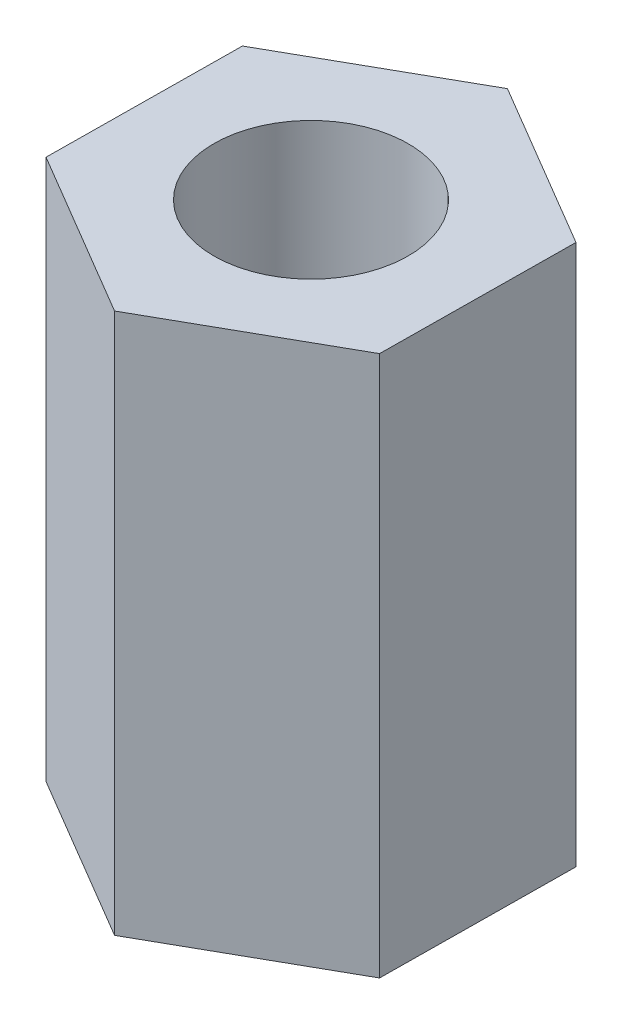
ISO-10303-21;
HEADER;
FILE_DESCRIPTION(('STEP AP214'),'2;1');
FILE_NAME('part.step','',(''),(''),'','','');
FILE_SCHEMA(('AUTOMOTIVE_DESIGN { 1 0 10303 214 1 1 1 1 }'));
ENDSEC;
DATA;
#1=APPLICATION_CONTEXT('core data for automotive mechanical design processes');
#2=APPLICATION_PROTOCOL_DEFINITION('international standard','automotive_design',2000,#1);
#3=PRODUCT_CONTEXT('',#1,'mechanical');
#4=PRODUCT('Part','Part','',(#3));
#5=PRODUCT_RELATED_PRODUCT_CATEGORY('part','',(#4));
#6=PRODUCT_DEFINITION_FORMATION('','',#4);
#7=PRODUCT_DEFINITION_CONTEXT('part definition',#1,'design');
#8=PRODUCT_DEFINITION('design','',#6,#7);
#9=PRODUCT_DEFINITION_SHAPE('','',#8);
#10=(LENGTH_UNIT() NAMED_UNIT(*) SI_UNIT(.MILLI.,.METRE.));
#11=(NAMED_UNIT(*) PLANE_ANGLE_UNIT() SI_UNIT($,.RADIAN.));
#12=(NAMED_UNIT(*) SI_UNIT($,.STERADIAN.) SOLID_ANGLE_UNIT());
#13=UNCERTAINTY_MEASURE_WITH_UNIT(LENGTH_MEASURE(1.E-05),#10,'distance_accuracy_value','');
#14=(GEOMETRIC_REPRESENTATION_CONTEXT(3) GLOBAL_UNCERTAINTY_ASSIGNED_CONTEXT((#13)) GLOBAL_UNIT_ASSIGNED_CONTEXT((#10,
#11,#12)) REPRESENTATION_CONTEXT('',''));
#15=CARTESIAN_POINT('',(0.,0.,0.));
#16=DIRECTION('',(0.,0.,1.));
#17=DIRECTION('',(1.,0.,0.));
#18=AXIS2_PLACEMENT_3D('',#15,#16,#17);
#19=CARTESIAN_POINT('',(0.,8.34,0.));
#20=DIRECTION('',(0.,1.,0.));
#21=DIRECTION('',(0.,0.,1.));
#22=AXIS2_PLACEMENT_3D('',#19,#20,#21);
#23=PLANE('',#22);
#24=DIRECTION('',(-0.870950486189625,0.,0.491370787294132));
#25=VECTOR('',#24,1.);
#26=CARTESIAN_POINT('',(0.0298069758616038,8.34,-2.99985192037707));
#27=LINE('',#26,#25);
#28=CARTESIAN_POINT('',(0.0298069758616038,8.34,-2.99985192037707));
#29=VERTEX_POINT('',#28);
#30=CARTESIAN_POINT('',(-2.58304448270727,8.34,-1.52573955849467));
#31=VERTEX_POINT('',#30);
#32=EDGE_CURVE('E132',#29,#31,#27,.T.);
#33=ORIENTED_EDGE('',*,*,#32,.T.);
#34=DIRECTION('',(-0.00993565862053424,0.,0.99995064012569));
#35=VECTOR('',#34,1.);
#36=CARTESIAN_POINT('',(-2.58304448270727,8.34,-1.52573955849467));
#37=LINE('',#36,#35);
#38=CARTESIAN_POINT('',(-2.61285145856888,8.34,1.4741123618824));
#39=VERTEX_POINT('',#38);
#40=EDGE_CURVE('E90',#31,#39,#37,.T.);
#41=ORIENTED_EDGE('',*,*,#40,.T.);
#42=DIRECTION('',(0.861014827569091,0.,0.508579852831557));
#43=VECTOR('',#42,1.);
#44=CARTESIAN_POINT('',(-2.61285145856888,8.34,1.4741123618824));
#45=LINE('',#44,#43);
#46=CARTESIAN_POINT('',(-0.0298069758616014,8.34,2.99985192037707));
#47=VERTEX_POINT('',#46);
#48=EDGE_CURVE('E103',#39,#47,#45,.T.);
#49=ORIENTED_EDGE('',*,*,#48,.T.);
#50=DIRECTION('',(0.870950486189626,0.,-0.491370787294132));
#51=VECTOR('',#50,1.);
#52=CARTESIAN_POINT('',(-0.0298069758616014,8.34,2.99985192037707));
#53=LINE('',#52,#51);
#54=CARTESIAN_POINT('',(2.58304448270727,8.34,1.52573955849467));
#55=VERTEX_POINT('',#54);
#56=EDGE_CURVE('E97',#47,#55,#53,.T.);
#57=ORIENTED_EDGE('',*,*,#56,.T.);
#58=DIRECTION('',(0.00993565862053424,0.,-0.99995064012569));
#59=VECTOR('',#58,1.);
#60=CARTESIAN_POINT('',(2.58304448270727,8.34,1.52573955849467));
#61=LINE('',#60,#59);
#62=CARTESIAN_POINT('',(2.61285145856888,8.34,-1.4741123618824));
#63=VERTEX_POINT('',#62);
#64=EDGE_CURVE('E101',#55,#63,#61,.T.);
#65=ORIENTED_EDGE('',*,*,#64,.T.);
#66=DIRECTION('',(-0.861014827569091,0.,-0.508579852831558));
#67=VECTOR('',#66,1.);
#68=CARTESIAN_POINT('',(2.61285145856888,8.34,-1.4741123618824));
#69=LINE('',#68,#67);
#70=EDGE_CURVE('E53',#63,#29,#69,.T.);
#71=ORIENTED_EDGE('',*,*,#70,.T.);
#72=EDGE_LOOP('',(#33,#41,#49,#57,#65,#71));
#73=FACE_BOUND('',#72,.T.);
#74=CARTESIAN_POINT('',(0.,8.34,0.));
#75=DIRECTION('',(0.,1.,0.));
#76=DIRECTION('',(0.,0.,1.));
#77=AXIS2_PLACEMENT_3D('',#74,#75,#76);
#78=CIRCLE('',#77,1.5);
#79=CARTESIAN_POINT('',(0.,8.34,1.5));
#80=VERTEX_POINT('',#79);
#81=EDGE_CURVE('E125',#80,#80,#78,.T.);
#82=ORIENTED_EDGE('',*,*,#81,.F.);
#83=EDGE_LOOP('',(#82));
#84=FACE_BOUND('',#83,.T.);
#85=ADVANCED_FACE('F36',(#73,#84),#23,.T.);
#86=CARTESIAN_POINT('',(0.,0.,0.));
#87=DIRECTION('',(0.,1.,0.));
#88=DIRECTION('',(0.,0.,1.));
#89=AXIS2_PLACEMENT_3D('',#86,#87,#88);
#90=PLANE('',#89);
#91=DIRECTION('',(-0.870950486189625,0.,0.491370787294132));
#92=VECTOR('',#91,1.);
#93=CARTESIAN_POINT('',(0.0298069758616038,0.,-2.99985192037707));
#94=LINE('',#93,#92);
#95=CARTESIAN_POINT('',(0.0298069758616038,0.,-2.99985192037707));
#96=VERTEX_POINT('',#95);
#97=CARTESIAN_POINT('',(-2.58304448270727,0.,-1.52573955849467));
#98=VERTEX_POINT('',#97);
#99=EDGE_CURVE('E121',#96,#98,#94,.T.);
#100=ORIENTED_EDGE('',*,*,#99,.F.);
#101=DIRECTION('',(-0.861014827569091,0.,-0.508579852831558));
#102=VECTOR('',#101,1.);
#103=CARTESIAN_POINT('',(2.61285145856888,0.,-1.4741123618824));
#104=LINE('',#103,#102);
#105=CARTESIAN_POINT('',(2.61285145856888,0.,-1.4741123618824));
#106=VERTEX_POINT('',#105);
#107=EDGE_CURVE('E82',#106,#96,#104,.T.);
#108=ORIENTED_EDGE('',*,*,#107,.F.);
#109=DIRECTION('',(0.00993565862053424,0.,-0.99995064012569));
#110=VECTOR('',#109,1.);
#111=CARTESIAN_POINT('',(2.58304448270727,0.,1.52573955849467));
#112=LINE('',#111,#110);
#113=CARTESIAN_POINT('',(2.58304448270727,0.,1.52573955849467));
#114=VERTEX_POINT('',#113);
#115=EDGE_CURVE('E76',#114,#106,#112,.T.);
#116=ORIENTED_EDGE('',*,*,#115,.F.);
#117=DIRECTION('',(0.870950486189626,0.,-0.491370787294132));
#118=VECTOR('',#117,1.);
#119=CARTESIAN_POINT('',(-0.0298069758616014,0.,2.99985192037707));
#120=LINE('',#119,#118);
#121=CARTESIAN_POINT('',(-0.0298069758616014,0.,2.99985192037707));
#122=VERTEX_POINT('',#121);
#123=EDGE_CURVE('E111',#122,#114,#120,.T.);
#124=ORIENTED_EDGE('',*,*,#123,.F.);
#125=DIRECTION('',(0.861014827569091,0.,0.508579852831557));
#126=VECTOR('',#125,1.);
#127=CARTESIAN_POINT('',(-2.61285145856888,0.,1.4741123618824));
#128=LINE('',#127,#126);
#129=CARTESIAN_POINT('',(-2.61285145856888,0.,1.4741123618824));
#130=VERTEX_POINT('',#129);
#131=EDGE_CURVE('E127',#130,#122,#128,.T.);
#132=ORIENTED_EDGE('',*,*,#131,.F.);
#133=DIRECTION('',(-0.00993565862053424,0.,0.99995064012569));
#134=VECTOR('',#133,1.);
#135=CARTESIAN_POINT('',(-2.58304448270727,0.,-1.52573955849467));
#136=LINE('',#135,#134);
#137=EDGE_CURVE('E124',#98,#130,#136,.T.);
#138=ORIENTED_EDGE('',*,*,#137,.F.);
#139=EDGE_LOOP('',(#100,#108,#116,#124,#132,#138));
#140=FACE_BOUND('',#139,.T.);
#141=CARTESIAN_POINT('',(0.,0.,0.));
#142=DIRECTION('',(0.,1.,0.));
#143=DIRECTION('',(0.,0.,1.));
#144=AXIS2_PLACEMENT_3D('',#141,#142,#143);
#145=CIRCLE('',#144,1.5);
#146=CARTESIAN_POINT('',(0.,0.,1.5));
#147=VERTEX_POINT('',#146);
#148=EDGE_CURVE('E225',#147,#147,#145,.T.);
#149=ORIENTED_EDGE('',*,*,#148,.T.);
#150=EDGE_LOOP('',(#149));
#151=FACE_BOUND('',#150,.T.);
#152=ADVANCED_FACE('F141',(#140,#151),#90,.F.);
#153=CARTESIAN_POINT('',(0.0298069758616038,8.34,-2.99985192037707));
#154=DIRECTION('',(0.491370787294132,0.,0.870950486189625));
#155=DIRECTION('',(0.870950486189626,0.,-0.491370787294132));
#156=AXIS2_PLACEMENT_3D('',#153,#154,#155);
#157=PLANE('',#156);
#158=ORIENTED_EDGE('',*,*,#99,.T.);
#159=DIRECTION('',(0.,-1.,0.));
#160=VECTOR('',#159,1.);
#161=CARTESIAN_POINT('',(-2.58304448270727,8.34,-1.52573955849467));
#162=LINE('',#161,#160);
#163=EDGE_CURVE('E11',#31,#98,#162,.T.);
#164=ORIENTED_EDGE('',*,*,#163,.F.);
#165=ORIENTED_EDGE('',*,*,#32,.F.);
#166=DIRECTION('',(0.,-1.,0.));
#167=VECTOR('',#166,1.);
#168=CARTESIAN_POINT('',(0.0298069758616038,8.34,-2.99985192037707));
#169=LINE('',#168,#167);
#170=EDGE_CURVE('E117',#29,#96,#169,.T.);
#171=ORIENTED_EDGE('',*,*,#170,.T.);
#172=EDGE_LOOP('',(#158,#164,#165,#171));
#173=FACE_BOUND('',#172,.T.);
#174=ADVANCED_FACE('F38',(#173),#157,.F.);
#175=CARTESIAN_POINT('',(-2.58304448270727,8.34,-1.52573955849467));
#176=DIRECTION('',(0.99995064012569,0.,0.00993565862053424));
#177=DIRECTION('',(0.00993565862053424,0.,-0.99995064012569));
#178=AXIS2_PLACEMENT_3D('',#175,#176,#177);
#179=PLANE('',#178);
#180=ORIENTED_EDGE('',*,*,#137,.T.);
#181=DIRECTION('',(0.,-1.,0.));
#182=VECTOR('',#181,1.);
#183=CARTESIAN_POINT('',(-2.61285145856888,8.34,1.4741123618824));
#184=LINE('',#183,#182);
#185=EDGE_CURVE('E45',#39,#130,#184,.T.);
#186=ORIENTED_EDGE('',*,*,#185,.F.);
#187=ORIENTED_EDGE('',*,*,#40,.F.);
#188=ORIENTED_EDGE('',*,*,#163,.T.);
#189=EDGE_LOOP('',(#180,#186,#187,#188));
#190=FACE_BOUND('',#189,.T.);
#191=ADVANCED_FACE('F166',(#190),#179,.F.);
#192=CARTESIAN_POINT('',(-2.61285145856888,8.34,1.4741123618824));
#193=DIRECTION('',(0.508579852831557,0.,-0.861014827569091));
#194=DIRECTION('',(-0.861014827569091,0.,-0.508579852831557));
#195=AXIS2_PLACEMENT_3D('',#192,#193,#194);
#196=PLANE('',#195);
#197=ORIENTED_EDGE('',*,*,#131,.T.);
#198=DIRECTION('',(0.,-1.,0.));
#199=VECTOR('',#198,1.);
#200=CARTESIAN_POINT('',(-0.0298069758616014,8.34,2.99985192037707));
#201=LINE('',#200,#199);
#202=EDGE_CURVE('E112',#47,#122,#201,.T.);
#203=ORIENTED_EDGE('',*,*,#202,.F.);
#204=ORIENTED_EDGE('',*,*,#48,.F.);
#205=ORIENTED_EDGE('',*,*,#185,.T.);
#206=EDGE_LOOP('',(#197,#203,#204,#205));
#207=FACE_BOUND('',#206,.T.);
#208=ADVANCED_FACE('F138',(#207),#196,.F.);
#209=CARTESIAN_POINT('',(-0.0298069758616014,8.34,2.99985192037707));
#210=DIRECTION('',(-0.491370787294132,0.,-0.870950486189625));
#211=DIRECTION('',(-0.870950486189625,0.,0.491370787294132));
#212=AXIS2_PLACEMENT_3D('',#209,#210,#211);
#213=PLANE('',#212);
#214=ORIENTED_EDGE('',*,*,#123,.T.);
#215=DIRECTION('',(0.,-1.,0.));
#216=VECTOR('',#215,1.);
#217=CARTESIAN_POINT('',(2.58304448270727,8.34,1.52573955849467));
#218=LINE('',#217,#216);
#219=EDGE_CURVE('E108',#55,#114,#218,.T.);
#220=ORIENTED_EDGE('',*,*,#219,.F.);
#221=ORIENTED_EDGE('',*,*,#56,.F.);
#222=ORIENTED_EDGE('',*,*,#202,.T.);
#223=EDGE_LOOP('',(#214,#220,#221,#222));
#224=FACE_BOUND('',#223,.T.);
#225=ADVANCED_FACE('F109',(#224),#213,.F.);
#226=CARTESIAN_POINT('',(2.58304448270727,8.34,1.52573955849467));
#227=DIRECTION('',(-0.99995064012569,0.,-0.00993565862053424));
#228=DIRECTION('',(-0.00993565862053424,0.,0.99995064012569));
#229=AXIS2_PLACEMENT_3D('',#226,#227,#228);
#230=PLANE('',#229);
#231=ORIENTED_EDGE('',*,*,#115,.T.);
#232=DIRECTION('',(0.,-1.,0.));
#233=VECTOR('',#232,1.);
#234=CARTESIAN_POINT('',(2.61285145856888,8.34,-1.4741123618824));
#235=LINE('',#234,#233);
#236=EDGE_CURVE('E113',#63,#106,#235,.T.);
#237=ORIENTED_EDGE('',*,*,#236,.F.);
#238=ORIENTED_EDGE('',*,*,#64,.F.);
#239=ORIENTED_EDGE('',*,*,#219,.T.);
#240=EDGE_LOOP('',(#231,#237,#238,#239));
#241=FACE_BOUND('',#240,.T.);
#242=ADVANCED_FACE('F115',(#241),#230,.F.);
#243=CARTESIAN_POINT('',(2.61285145856888,8.34,-1.4741123618824));
#244=DIRECTION('',(-0.508579852831558,0.,0.861014827569091));
#245=DIRECTION('',(0.861014827569091,0.,0.508579852831558));
#246=AXIS2_PLACEMENT_3D('',#243,#244,#245);
#247=PLANE('',#246);
#248=ORIENTED_EDGE('',*,*,#107,.T.);
#249=ORIENTED_EDGE('',*,*,#170,.F.);
#250=ORIENTED_EDGE('',*,*,#70,.F.);
#251=ORIENTED_EDGE('',*,*,#236,.T.);
#252=EDGE_LOOP('',(#248,#249,#250,#251));
#253=FACE_BOUND('',#252,.T.);
#254=ADVANCED_FACE('F146',(#253),#247,.F.);
#255=CARTESIAN_POINT('',(0.,8.34,0.));
#256=DIRECTION('',(0.,-1.,0.));
#257=DIRECTION('',(0.,0.,-1.));
#258=AXIS2_PLACEMENT_3D('',#255,#256,#257);
#259=CYLINDRICAL_SURFACE('',#258,1.5);
#260=ORIENTED_EDGE('',*,*,#81,.T.);
#261=EDGE_LOOP('',(#260));
#262=FACE_BOUND('',#261,.T.);
#263=ORIENTED_EDGE('',*,*,#148,.F.);
#264=EDGE_LOOP('',(#263));
#265=FACE_BOUND('',#264,.T.);
#266=ADVANCED_FACE('F148',(#262,#265),#259,.F.);
#267=CLOSED_SHELL('',(#85,#152,#174,#191,#208,#225,#242,#254,#266));
#268=MANIFOLD_SOLID_BREP('B2',#267);
#269=ADVANCED_BREP_SHAPE_REPRESENTATION('',(#18,#268),#14);
#270=SHAPE_DEFINITION_REPRESENTATION(#9,#269);
ENDSEC;
END-ISO-10303-21;
